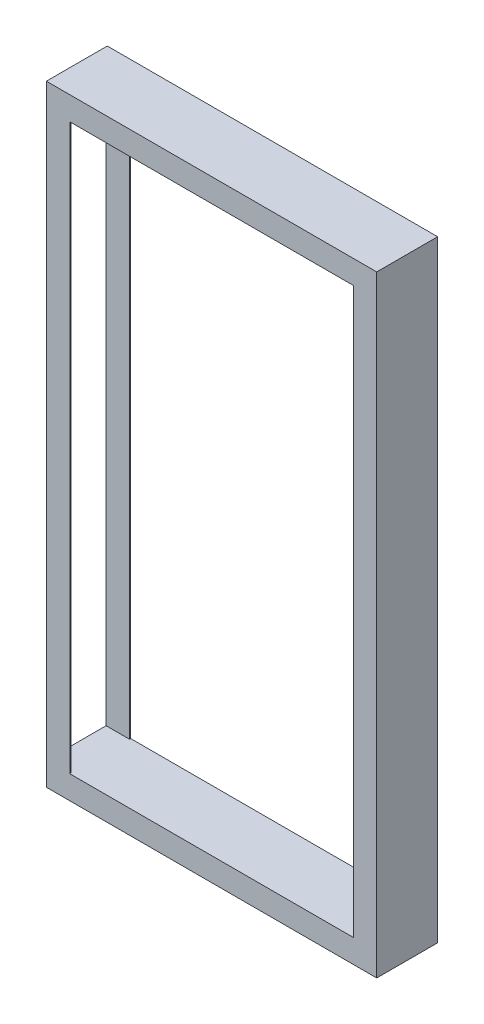
ISO-10303-21;
HEADER;
FILE_DESCRIPTION(('STEP AP214'),'2;1');
FILE_NAME('part.step','',(''),(''),'','','');
FILE_SCHEMA(('AUTOMOTIVE_DESIGN { 1 0 10303 214 1 1 1 1 }'));
ENDSEC;
DATA;
#1=APPLICATION_CONTEXT('core data for automotive mechanical design processes');
#2=APPLICATION_PROTOCOL_DEFINITION('international standard','automotive_design',2000,#1);
#3=PRODUCT_CONTEXT('',#1,'mechanical');
#4=PRODUCT('Part','Part','',(#3));
#5=PRODUCT_RELATED_PRODUCT_CATEGORY('part','',(#4));
#6=PRODUCT_DEFINITION_FORMATION('','',#4);
#7=PRODUCT_DEFINITION_CONTEXT('part definition',#1,'design');
#8=PRODUCT_DEFINITION('design','',#6,#7);
#9=PRODUCT_DEFINITION_SHAPE('','',#8);
#10=(LENGTH_UNIT() NAMED_UNIT(*) SI_UNIT(.MILLI.,.METRE.));
#11=(NAMED_UNIT(*) PLANE_ANGLE_UNIT() SI_UNIT($,.RADIAN.));
#12=(NAMED_UNIT(*) SI_UNIT($,.STERADIAN.) SOLID_ANGLE_UNIT());
#13=UNCERTAINTY_MEASURE_WITH_UNIT(LENGTH_MEASURE(1.E-05),#10,'distance_accuracy_value','');
#14=(GEOMETRIC_REPRESENTATION_CONTEXT(3) GLOBAL_UNCERTAINTY_ASSIGNED_CONTEXT((#13)) GLOBAL_UNIT_ASSIGNED_CONTEXT((#10,
#11,#12)) REPRESENTATION_CONTEXT('',''));
#15=CARTESIAN_POINT('',(0.,0.,0.));
#16=DIRECTION('',(0.,0.,1.));
#17=DIRECTION('',(1.,0.,0.));
#18=AXIS2_PLACEMENT_3D('',#15,#16,#17);
#19=CARTESIAN_POINT('',(-60.5,-120.5,26.));
#20=DIRECTION('',(1.,0.,0.));
#21=DIRECTION('',(0.,0.,-1.));
#22=AXIS2_PLACEMENT_3D('',#19,#20,#21);
#23=PLANE('',#22);
#24=DIRECTION('',(0.,-1.,0.));
#25=VECTOR('',#24,1.);
#26=CARTESIAN_POINT('',(-60.5,-120.5,25.5));
#27=LINE('',#26,#25);
#28=CARTESIAN_POINT('',(-60.5,120.5,25.5));
#29=VERTEX_POINT('',#28);
#30=CARTESIAN_POINT('',(-60.5,-120.5,25.5));
#31=VERTEX_POINT('',#30);
#32=EDGE_CURVE('E69',#29,#31,#27,.T.);
#33=ORIENTED_EDGE('',*,*,#32,.F.);
#34=DIRECTION('',(0.,0.,-1.));
#35=VECTOR('',#34,1.);
#36=CARTESIAN_POINT('',(-60.5,120.5,26.));
#37=LINE('',#36,#35);
#38=CARTESIAN_POINT('',(-60.5,120.5,26.));
#39=VERTEX_POINT('',#38);
#40=EDGE_CURVE('E220',#39,#29,#37,.T.);
#41=ORIENTED_EDGE('',*,*,#40,.F.);
#42=DIRECTION('',(0.,-1.,0.));
#43=VECTOR('',#42,1.);
#44=CARTESIAN_POINT('',(-60.5,-120.5,26.));
#45=LINE('',#44,#43);
#46=CARTESIAN_POINT('',(-60.5,-120.5,26.));
#47=VERTEX_POINT('',#46);
#48=EDGE_CURVE('E183',#39,#47,#45,.T.);
#49=ORIENTED_EDGE('',*,*,#48,.T.);
#50=DIRECTION('',(0.,0.,-1.));
#51=VECTOR('',#50,1.);
#52=CARTESIAN_POINT('',(-60.5,-120.5,26.));
#53=LINE('',#52,#51);
#54=EDGE_CURVE('E215',#47,#31,#53,.T.);
#55=ORIENTED_EDGE('',*,*,#54,.T.);
#56=EDGE_LOOP('',(#33,#41,#49,#55));
#57=FACE_BOUND('',#56,.T.);
#58=ADVANCED_FACE('F45',(#57),#23,.T.);
#59=CARTESIAN_POINT('',(0.,0.,26.));
#60=DIRECTION('',(0.,0.,1.));
#61=DIRECTION('',(1.,0.,0.));
#62=AXIS2_PLACEMENT_3D('',#59,#60,#61);
#63=PLANE('',#62);
#64=DIRECTION('',(0.,1.,0.));
#65=VECTOR('',#64,1.);
#66=CARTESIAN_POINT('',(70.5,-130.5,26.));
#67=LINE('',#66,#65);
#68=CARTESIAN_POINT('',(70.5,-130.5,26.));
#69=VERTEX_POINT('',#68);
#70=CARTESIAN_POINT('',(70.5,130.5,26.));
#71=VERTEX_POINT('',#70);
#72=EDGE_CURVE('E225',#69,#71,#67,.T.);
#73=ORIENTED_EDGE('',*,*,#72,.T.);
#74=DIRECTION('',(-1.,0.,0.));
#75=VECTOR('',#74,1.);
#76=CARTESIAN_POINT('',(70.5,130.5,26.));
#77=LINE('',#76,#75);
#78=CARTESIAN_POINT('',(-70.5,130.5,26.));
#79=VERTEX_POINT('',#78);
#80=EDGE_CURVE('E229',#71,#79,#77,.T.);
#81=ORIENTED_EDGE('',*,*,#80,.T.);
#82=DIRECTION('',(0.,-1.,0.));
#83=VECTOR('',#82,1.);
#84=CARTESIAN_POINT('',(-70.5,-130.5,26.));
#85=LINE('',#84,#83);
#86=CARTESIAN_POINT('',(-70.5,-130.5,26.));
#87=VERTEX_POINT('',#86);
#88=EDGE_CURVE('E233',#79,#87,#85,.T.);
#89=ORIENTED_EDGE('',*,*,#88,.T.);
#90=DIRECTION('',(1.,0.,0.));
#91=VECTOR('',#90,1.);
#92=CARTESIAN_POINT('',(70.5,-130.5,26.));
#93=LINE('',#92,#91);
#94=EDGE_CURVE('E236',#87,#69,#93,.T.);
#95=ORIENTED_EDGE('',*,*,#94,.T.);
#96=EDGE_LOOP('',(#73,#81,#89,#95));
#97=FACE_BOUND('',#96,.T.);
#98=ORIENTED_EDGE('',*,*,#48,.F.);
#99=DIRECTION('',(-1.,0.,0.));
#100=VECTOR('',#99,1.);
#101=CARTESIAN_POINT('',(60.5,120.5,26.));
#102=LINE('',#101,#100);
#103=CARTESIAN_POINT('',(60.5,120.5,26.));
#104=VERTEX_POINT('',#103);
#105=EDGE_CURVE('E180',#104,#39,#102,.T.);
#106=ORIENTED_EDGE('',*,*,#105,.F.);
#107=DIRECTION('',(0.,1.,0.));
#108=VECTOR('',#107,1.);
#109=CARTESIAN_POINT('',(60.5,-120.5,26.));
#110=LINE('',#109,#108);
#111=CARTESIAN_POINT('',(60.5,-120.5,26.));
#112=VERTEX_POINT('',#111);
#113=EDGE_CURVE('E191',#112,#104,#110,.T.);
#114=ORIENTED_EDGE('',*,*,#113,.F.);
#115=DIRECTION('',(1.,0.,0.));
#116=VECTOR('',#115,1.);
#117=CARTESIAN_POINT('',(60.5,-120.5,26.));
#118=LINE('',#117,#116);
#119=EDGE_CURVE('E187',#47,#112,#118,.T.);
#120=ORIENTED_EDGE('',*,*,#119,.F.);
#121=EDGE_LOOP('',(#98,#106,#114,#120));
#122=FACE_BOUND('',#121,.T.);
#123=ADVANCED_FACE('F277',(#97,#122),#63,.T.);
#124=CARTESIAN_POINT('',(0.,0.,0.));
#125=DIRECTION('',(0.,0.,1.));
#126=DIRECTION('',(1.,0.,0.));
#127=AXIS2_PLACEMENT_3D('',#124,#125,#126);
#128=PLANE('',#127);
#129=DIRECTION('',(0.,1.,0.));
#130=VECTOR('',#129,1.);
#131=CARTESIAN_POINT('',(70.5,-130.5,0.));
#132=LINE('',#131,#130);
#133=CARTESIAN_POINT('',(70.5,-130.5,0.));
#134=VERTEX_POINT('',#133);
#135=CARTESIAN_POINT('',(70.5,130.5,0.));
#136=VERTEX_POINT('',#135);
#137=EDGE_CURVE('E224',#134,#136,#132,.T.);
#138=ORIENTED_EDGE('',*,*,#137,.F.);
#139=DIRECTION('',(1.,0.,0.));
#140=VECTOR('',#139,1.);
#141=CARTESIAN_POINT('',(70.5,-130.5,0.));
#142=LINE('',#141,#140);
#143=CARTESIAN_POINT('',(-70.5,-130.5,0.));
#144=VERTEX_POINT('',#143);
#145=EDGE_CURVE('E230',#144,#134,#142,.T.);
#146=ORIENTED_EDGE('',*,*,#145,.F.);
#147=DIRECTION('',(0.,-1.,0.));
#148=VECTOR('',#147,1.);
#149=CARTESIAN_POINT('',(-70.5,-130.5,0.));
#150=LINE('',#149,#148);
#151=CARTESIAN_POINT('',(-70.5,130.5,0.));
#152=VERTEX_POINT('',#151);
#153=EDGE_CURVE('E246',#152,#144,#150,.T.);
#154=ORIENTED_EDGE('',*,*,#153,.F.);
#155=DIRECTION('',(-1.,0.,0.));
#156=VECTOR('',#155,1.);
#157=CARTESIAN_POINT('',(70.5,130.5,0.));
#158=LINE('',#157,#156);
#159=EDGE_CURVE('E243',#136,#152,#158,.T.);
#160=ORIENTED_EDGE('',*,*,#159,.F.);
#161=EDGE_LOOP('',(#138,#146,#154,#160));
#162=FACE_BOUND('',#161,.T.);
#163=DIRECTION('',(-1.,0.,0.));
#164=VECTOR('',#163,1.);
#165=CARTESIAN_POINT('',(60.5,120.5,0.));
#166=LINE('',#165,#164);
#167=CARTESIAN_POINT('',(60.5,120.5,0.));
#168=VERTEX_POINT('',#167);
#169=CARTESIAN_POINT('',(-60.5,120.5,0.));
#170=VERTEX_POINT('',#169);
#171=EDGE_CURVE('E174',#168,#170,#166,.T.);
#172=ORIENTED_EDGE('',*,*,#171,.T.);
#173=DIRECTION('',(0.,-1.,0.));
#174=VECTOR('',#173,1.);
#175=CARTESIAN_POINT('',(-60.5,-120.5,0.));
#176=LINE('',#175,#174);
#177=CARTESIAN_POINT('',(-60.5,-120.5,0.));
#178=VERTEX_POINT('',#177);
#179=EDGE_CURVE('E198',#170,#178,#176,.T.);
#180=ORIENTED_EDGE('',*,*,#179,.T.);
#181=DIRECTION('',(1.,0.,0.));
#182=VECTOR('',#181,1.);
#183=CARTESIAN_POINT('',(60.5,-120.5,0.));
#184=LINE('',#183,#182);
#185=CARTESIAN_POINT('',(60.5,-120.5,0.));
#186=VERTEX_POINT('',#185);
#187=EDGE_CURVE('E202',#178,#186,#184,.T.);
#188=ORIENTED_EDGE('',*,*,#187,.T.);
#189=DIRECTION('',(0.,1.,0.));
#190=VECTOR('',#189,1.);
#191=CARTESIAN_POINT('',(60.5,-120.5,0.));
#192=LINE('',#191,#190);
#193=EDGE_CURVE('E184',#186,#168,#192,.T.);
#194=ORIENTED_EDGE('',*,*,#193,.T.);
#195=EDGE_LOOP('',(#172,#180,#188,#194));
#196=FACE_BOUND('',#195,.T.);
#197=ADVANCED_FACE('F267',(#162,#196),#128,.F.);
#198=CARTESIAN_POINT('',(70.5,-130.5,26.));
#199=DIRECTION('',(-1.,0.,0.));
#200=DIRECTION('',(0.,0.,1.));
#201=AXIS2_PLACEMENT_3D('',#198,#199,#200);
#202=PLANE('',#201);
#203=ORIENTED_EDGE('',*,*,#137,.T.);
#204=DIRECTION('',(0.,0.,-1.));
#205=VECTOR('',#204,1.);
#206=CARTESIAN_POINT('',(70.5,130.5,26.));
#207=LINE('',#206,#205);
#208=EDGE_CURVE('E11',#71,#136,#207,.T.);
#209=ORIENTED_EDGE('',*,*,#208,.F.);
#210=ORIENTED_EDGE('',*,*,#72,.F.);
#211=DIRECTION('',(0.,0.,-1.));
#212=VECTOR('',#211,1.);
#213=CARTESIAN_POINT('',(70.5,-130.5,26.));
#214=LINE('',#213,#212);
#215=EDGE_CURVE('E239',#69,#134,#214,.T.);
#216=ORIENTED_EDGE('',*,*,#215,.T.);
#217=EDGE_LOOP('',(#203,#209,#210,#216));
#218=FACE_BOUND('',#217,.T.);
#219=ADVANCED_FACE('F47',(#218),#202,.F.);
#220=CARTESIAN_POINT('',(70.5,130.5,26.));
#221=DIRECTION('',(0.,-1.,0.));
#222=DIRECTION('',(0.,0.,-1.));
#223=AXIS2_PLACEMENT_3D('',#220,#221,#222);
#224=PLANE('',#223);
#225=ORIENTED_EDGE('',*,*,#159,.T.);
#226=DIRECTION('',(0.,0.,-1.));
#227=VECTOR('',#226,1.);
#228=CARTESIAN_POINT('',(-70.5,130.5,26.));
#229=LINE('',#228,#227);
#230=EDGE_CURVE('E54',#79,#152,#229,.T.);
#231=ORIENTED_EDGE('',*,*,#230,.F.);
#232=ORIENTED_EDGE('',*,*,#80,.F.);
#233=ORIENTED_EDGE('',*,*,#208,.T.);
#234=EDGE_LOOP('',(#225,#231,#232,#233));
#235=FACE_BOUND('',#234,.T.);
#236=ADVANCED_FACE('F279',(#235),#224,.F.);
#237=CARTESIAN_POINT('',(-70.5,-130.5,26.));
#238=DIRECTION('',(1.,0.,0.));
#239=DIRECTION('',(0.,0.,-1.));
#240=AXIS2_PLACEMENT_3D('',#237,#238,#239);
#241=PLANE('',#240);
#242=DIRECTION('',(0.,-1.,0.));
#243=VECTOR('',#242,1.);
#244=CARTESIAN_POINT('',(-70.5,-120.5,25.5));
#245=LINE('',#244,#243);
#246=CARTESIAN_POINT('',(-70.5,120.5,25.5));
#247=VERTEX_POINT('',#246);
#248=CARTESIAN_POINT('',(-70.5,-120.5,25.5));
#249=VERTEX_POINT('',#248);
#250=EDGE_CURVE('E148',#247,#249,#245,.T.);
#251=ORIENTED_EDGE('',*,*,#250,.T.);
#252=DIRECTION('',(0.,0.,-1.));
#253=VECTOR('',#252,1.);
#254=CARTESIAN_POINT('',(-70.5,-120.5,0.5));
#255=LINE('',#254,#253);
#256=CARTESIAN_POINT('',(-70.5,-120.5,0.5));
#257=VERTEX_POINT('',#256);
#258=EDGE_CURVE('E140',#249,#257,#255,.T.);
#259=ORIENTED_EDGE('',*,*,#258,.T.);
#260=DIRECTION('',(0.,1.,0.));
#261=VECTOR('',#260,1.);
#262=CARTESIAN_POINT('',(-70.5,-120.5,0.5));
#263=LINE('',#262,#261);
#264=CARTESIAN_POINT('',(-70.5,120.5,0.5));
#265=VERTEX_POINT('',#264);
#266=EDGE_CURVE('E151',#257,#265,#263,.T.);
#267=ORIENTED_EDGE('',*,*,#266,.T.);
#268=DIRECTION('',(0.,0.,1.));
#269=VECTOR('',#268,1.);
#270=CARTESIAN_POINT('',(-70.5,120.5,0.5));
#271=LINE('',#270,#269);
#272=EDGE_CURVE('E61',#265,#247,#271,.T.);
#273=ORIENTED_EDGE('',*,*,#272,.T.);
#274=EDGE_LOOP('',(#251,#259,#267,#273));
#275=FACE_BOUND('',#274,.T.);
#276=ORIENTED_EDGE('',*,*,#153,.T.);
#277=DIRECTION('',(0.,0.,-1.));
#278=VECTOR('',#277,1.);
#279=CARTESIAN_POINT('',(-70.5,-130.5,26.));
#280=LINE('',#279,#278);
#281=EDGE_CURVE('E254',#87,#144,#280,.T.);
#282=ORIENTED_EDGE('',*,*,#281,.F.);
#283=ORIENTED_EDGE('',*,*,#88,.F.);
#284=ORIENTED_EDGE('',*,*,#230,.T.);
#285=EDGE_LOOP('',(#276,#282,#283,#284));
#286=FACE_BOUND('',#285,.T.);
#287=ADVANCED_FACE('F156',(#275,#286),#241,.F.);
#288=CARTESIAN_POINT('',(70.5,-130.5,26.));
#289=DIRECTION('',(0.,1.,0.));
#290=DIRECTION('',(0.,0.,1.));
#291=AXIS2_PLACEMENT_3D('',#288,#289,#290);
#292=PLANE('',#291);
#293=ORIENTED_EDGE('',*,*,#145,.T.);
#294=ORIENTED_EDGE('',*,*,#215,.F.);
#295=ORIENTED_EDGE('',*,*,#94,.F.);
#296=ORIENTED_EDGE('',*,*,#281,.T.);
#297=EDGE_LOOP('',(#293,#294,#295,#296));
#298=FACE_BOUND('',#297,.T.);
#299=ADVANCED_FACE('F271',(#298),#292,.F.);
#300=CARTESIAN_POINT('',(60.5,120.5,26.));
#301=DIRECTION('',(0.,-1.,0.));
#302=DIRECTION('',(0.,0.,-1.));
#303=AXIS2_PLACEMENT_3D('',#300,#301,#302);
#304=PLANE('',#303);
#305=ORIENTED_EDGE('',*,*,#171,.F.);
#306=DIRECTION('',(0.,0.,-1.));
#307=VECTOR('',#306,1.);
#308=CARTESIAN_POINT('',(60.5,120.5,26.));
#309=LINE('',#308,#307);
#310=EDGE_CURVE('E194',#104,#168,#309,.T.);
#311=ORIENTED_EDGE('',*,*,#310,.F.);
#312=ORIENTED_EDGE('',*,*,#105,.T.);
#313=ORIENTED_EDGE('',*,*,#40,.T.);
#314=DIRECTION('',(1.,0.,0.));
#315=VECTOR('',#314,1.);
#316=CARTESIAN_POINT('',(-70.5,120.5,25.5));
#317=LINE('',#316,#315);
#318=EDGE_CURVE('E175',#247,#29,#317,.T.);
#319=ORIENTED_EDGE('',*,*,#318,.F.);
#320=ORIENTED_EDGE('',*,*,#272,.F.);
#321=DIRECTION('',(1.,0.,0.));
#322=VECTOR('',#321,1.);
#323=CARTESIAN_POINT('',(-70.5,120.5,0.5));
#324=LINE('',#323,#322);
#325=CARTESIAN_POINT('',(-60.5,120.5,0.5));
#326=VERTEX_POINT('',#325);
#327=EDGE_CURVE('E147',#265,#326,#324,.T.);
#328=ORIENTED_EDGE('',*,*,#327,.T.);
#329=EDGE_CURVE('E219',#326,#170,#37,.T.);
#330=ORIENTED_EDGE('',*,*,#329,.T.);
#331=EDGE_LOOP('',(#305,#311,#312,#313,#319,#320,#328,#330));
#332=FACE_BOUND('',#331,.T.);
#333=ADVANCED_FACE('F299',(#332),#304,.T.);
#334=DIRECTION('',(0.,1.,0.));
#335=VECTOR('',#334,1.);
#336=CARTESIAN_POINT('',(-60.5,-120.5,0.5));
#337=LINE('',#336,#335);
#338=CARTESIAN_POINT('',(-60.5,-120.5,0.5));
#339=VERTEX_POINT('',#338);
#340=EDGE_CURVE('E162',#339,#326,#337,.T.);
#341=ORIENTED_EDGE('',*,*,#340,.F.);
#342=EDGE_CURVE('E142',#339,#178,#53,.T.);
#343=ORIENTED_EDGE('',*,*,#342,.T.);
#344=ORIENTED_EDGE('',*,*,#179,.F.);
#345=ORIENTED_EDGE('',*,*,#329,.F.);
#346=EDGE_LOOP('',(#341,#343,#344,#345));
#347=FACE_BOUND('',#346,.T.);
#348=ADVANCED_FACE('F290',(#347),#23,.T.);
#349=CARTESIAN_POINT('',(60.5,-120.5,26.));
#350=DIRECTION('',(0.,1.,0.));
#351=DIRECTION('',(0.,0.,1.));
#352=AXIS2_PLACEMENT_3D('',#349,#350,#351);
#353=PLANE('',#352);
#354=ORIENTED_EDGE('',*,*,#187,.F.);
#355=ORIENTED_EDGE('',*,*,#342,.F.);
#356=DIRECTION('',(1.,0.,0.));
#357=VECTOR('',#356,1.);
#358=CARTESIAN_POINT('',(-70.5,-120.5,0.5));
#359=LINE('',#358,#357);
#360=EDGE_CURVE('E135',#257,#339,#359,.T.);
#361=ORIENTED_EDGE('',*,*,#360,.F.);
#362=ORIENTED_EDGE('',*,*,#258,.F.);
#363=DIRECTION('',(1.,0.,0.));
#364=VECTOR('',#363,1.);
#365=CARTESIAN_POINT('',(-70.5,-120.5,25.5));
#366=LINE('',#365,#364);
#367=EDGE_CURVE('E171',#249,#31,#366,.T.);
#368=ORIENTED_EDGE('',*,*,#367,.T.);
#369=ORIENTED_EDGE('',*,*,#54,.F.);
#370=ORIENTED_EDGE('',*,*,#119,.T.);
#371=DIRECTION('',(0.,0.,-1.));
#372=VECTOR('',#371,1.);
#373=CARTESIAN_POINT('',(60.5,-120.5,26.));
#374=LINE('',#373,#372);
#375=EDGE_CURVE('E212',#112,#186,#374,.T.);
#376=ORIENTED_EDGE('',*,*,#375,.T.);
#377=EDGE_LOOP('',(#354,#355,#361,#362,#368,#369,#370,#376));
#378=FACE_BOUND('',#377,.T.);
#379=ADVANCED_FACE('F138',(#378),#353,.T.);
#380=CARTESIAN_POINT('',(60.5,-120.5,26.));
#381=DIRECTION('',(-1.,0.,0.));
#382=DIRECTION('',(0.,0.,1.));
#383=AXIS2_PLACEMENT_3D('',#380,#381,#382);
#384=PLANE('',#383);
#385=ORIENTED_EDGE('',*,*,#193,.F.);
#386=ORIENTED_EDGE('',*,*,#375,.F.);
#387=ORIENTED_EDGE('',*,*,#113,.T.);
#388=ORIENTED_EDGE('',*,*,#310,.T.);
#389=EDGE_LOOP('',(#385,#386,#387,#388));
#390=FACE_BOUND('',#389,.T.);
#391=ADVANCED_FACE('F305',(#390),#384,.T.);
#392=CARTESIAN_POINT('',(-70.5,-120.5,25.5));
#393=DIRECTION('',(0.,0.,1.));
#394=DIRECTION('',(1.,0.,0.));
#395=AXIS2_PLACEMENT_3D('',#392,#393,#394);
#396=PLANE('',#395);
#397=ORIENTED_EDGE('',*,*,#32,.T.);
#398=ORIENTED_EDGE('',*,*,#367,.F.);
#399=ORIENTED_EDGE('',*,*,#250,.F.);
#400=ORIENTED_EDGE('',*,*,#318,.T.);
#401=EDGE_LOOP('',(#397,#398,#399,#400));
#402=FACE_BOUND('',#401,.T.);
#403=ADVANCED_FACE('F319',(#402),#396,.F.);
#404=CARTESIAN_POINT('',(-70.5,-120.5,0.5));
#405=DIRECTION('',(0.,0.,-1.));
#406=DIRECTION('',(0.,1.,0.));
#407=AXIS2_PLACEMENT_3D('',#404,#405,#406);
#408=PLANE('',#407);
#409=ORIENTED_EDGE('',*,*,#340,.T.);
#410=ORIENTED_EDGE('',*,*,#327,.F.);
#411=ORIENTED_EDGE('',*,*,#266,.F.);
#412=ORIENTED_EDGE('',*,*,#360,.T.);
#413=EDGE_LOOP('',(#409,#410,#411,#412));
#414=FACE_BOUND('',#413,.T.);
#415=ADVANCED_FACE('F152',(#414),#408,.F.);
#416=CLOSED_SHELL('',(#58,#123,#197,#219,#236,#287,#299,#333,#348,#379,#391,#403,#415));
#417=MANIFOLD_SOLID_BREP('B2',#416);
#418=ADVANCED_BREP_SHAPE_REPRESENTATION('',(#18,#417),#14);
#419=SHAPE_DEFINITION_REPRESENTATION(#9,#418);
ENDSEC;
END-ISO-10303-21;
